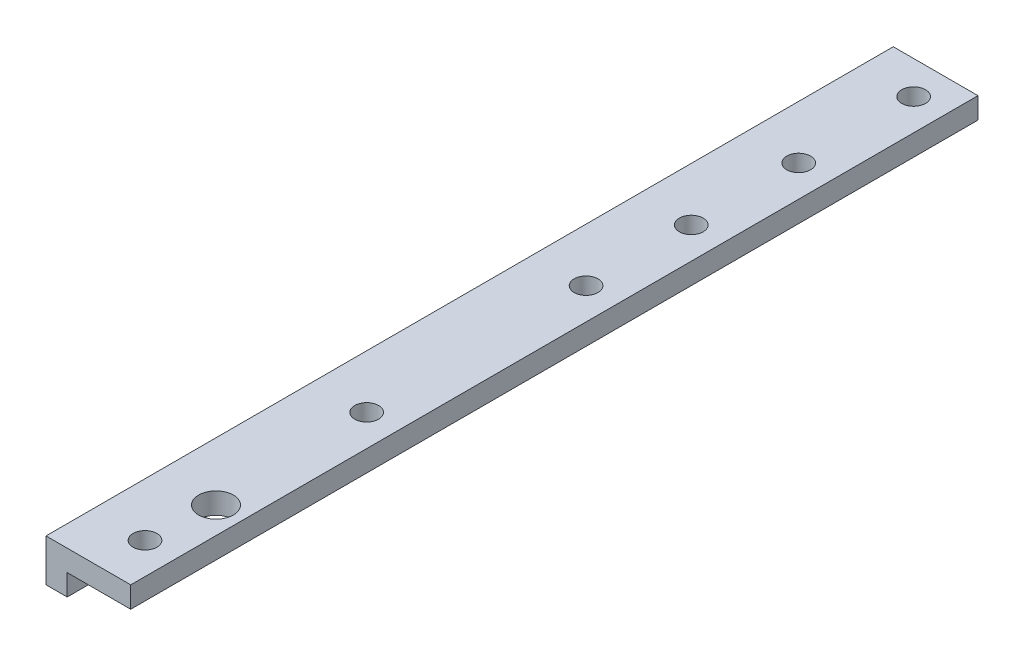
ISO-10303-21;
HEADER;
FILE_DESCRIPTION(('STEP AP214'),'2;1');
FILE_NAME('part.step','',(''),(''),'','','');
FILE_SCHEMA(('AUTOMOTIVE_DESIGN { 1 0 10303 214 1 1 1 1 }'));
ENDSEC;
DATA;
#1=APPLICATION_CONTEXT('core data for automotive mechanical design processes');
#2=APPLICATION_PROTOCOL_DEFINITION('international standard','automotive_design',2000,#1);
#3=PRODUCT_CONTEXT('',#1,'mechanical');
#4=PRODUCT('Part','Part','',(#3));
#5=PRODUCT_RELATED_PRODUCT_CATEGORY('part','',(#4));
#6=PRODUCT_DEFINITION_FORMATION('','',#4);
#7=PRODUCT_DEFINITION_CONTEXT('part definition',#1,'design');
#8=PRODUCT_DEFINITION('design','',#6,#7);
#9=PRODUCT_DEFINITION_SHAPE('','',#8);
#10=(LENGTH_UNIT() NAMED_UNIT(*) SI_UNIT(.MILLI.,.METRE.));
#11=(NAMED_UNIT(*) PLANE_ANGLE_UNIT() SI_UNIT($,.RADIAN.));
#12=(NAMED_UNIT(*) SI_UNIT($,.STERADIAN.) SOLID_ANGLE_UNIT());
#13=UNCERTAINTY_MEASURE_WITH_UNIT(LENGTH_MEASURE(1.E-05),#10,'distance_accuracy_value','');
#14=(GEOMETRIC_REPRESENTATION_CONTEXT(3) GLOBAL_UNCERTAINTY_ASSIGNED_CONTEXT((#13)) GLOBAL_UNIT_ASSIGNED_CONTEXT((#10,
#11,#12)) REPRESENTATION_CONTEXT('',''));
#15=CARTESIAN_POINT('',(0.,0.,0.));
#16=DIRECTION('',(0.,0.,1.));
#17=DIRECTION('',(1.,0.,0.));
#18=AXIS2_PLACEMENT_3D('',#15,#16,#17);
#19=CARTESIAN_POINT('',(16.,0.,160.));
#20=DIRECTION('',(0.,-1.,0.));
#21=DIRECTION('',(1.,0.,0.));
#22=AXIS2_PLACEMENT_3D('',#19,#20,#21);
#23=PLANE('',#22);
#24=CARTESIAN_POINT('',(10.9999999999979,0.,138.897931951044));
#25=DIRECTION('',(0.,-1.,0.));
#26=DIRECTION('',(1.,0.,0.));
#27=AXIS2_PLACEMENT_3D('',#24,#25,#26);
#28=CIRCLE('',#27,3.27500000000001);
#29=CARTESIAN_POINT('',(14.2749999999979,0.,138.897931951044));
#30=VERTEX_POINT('',#29);
#31=EDGE_CURVE('E202',#30,#30,#28,.T.);
#32=ORIENTED_EDGE('',*,*,#31,.T.);
#33=EDGE_LOOP('',(#32));
#34=FACE_BOUND('',#33,.T.);
#35=CARTESIAN_POINT('',(10.0723529947347,0.,6.22809053182057));
#36=DIRECTION('',(0.,-1.,0.));
#37=DIRECTION('',(0.,0.,-1.));
#38=AXIS2_PLACEMENT_3D('',#35,#36,#37);
#39=CIRCLE('',#38,2.25);
#40=CARTESIAN_POINT('',(10.0723529947347,0.,3.97809053182057));
#41=VERTEX_POINT('',#40);
#42=EDGE_CURVE('E196',#41,#41,#39,.T.);
#43=ORIENTED_EDGE('',*,*,#42,.T.);
#44=EDGE_LOOP('',(#43));
#45=FACE_BOUND('',#44,.T.);
#46=CARTESIAN_POINT('',(10.0723529947347,0.,27.9378724737865));
#47=DIRECTION('',(0.,-1.,0.));
#48=DIRECTION('',(0.,0.,-1.));
#49=AXIS2_PLACEMENT_3D('',#46,#47,#48);
#50=CIRCLE('',#49,2.25);
#51=CARTESIAN_POINT('',(10.0723529947347,0.,25.6878724737865));
#52=VERTEX_POINT('',#51);
#53=EDGE_CURVE('E190',#52,#52,#50,.T.);
#54=ORIENTED_EDGE('',*,*,#53,.T.);
#55=EDGE_LOOP('',(#54));
#56=FACE_BOUND('',#55,.T.);
#57=CARTESIAN_POINT('',(10.0723529947347,0.,48.2214643611708));
#58=DIRECTION('',(0.,-1.,0.));
#59=DIRECTION('',(0.,0.,-1.));
#60=AXIS2_PLACEMENT_3D('',#57,#58,#59);
#61=CIRCLE('',#60,2.25);
#62=CARTESIAN_POINT('',(10.0723529947347,0.,45.9714643611708));
#63=VERTEX_POINT('',#62);
#64=EDGE_CURVE('E184',#63,#63,#61,.T.);
#65=ORIENTED_EDGE('',*,*,#64,.T.);
#66=EDGE_LOOP('',(#65));
#67=FACE_BOUND('',#66,.T.);
#68=CARTESIAN_POINT('',(10.0723529947347,0.,68.0876218415207));
#69=DIRECTION('',(0.,-1.,0.));
#70=DIRECTION('',(0.,0.,-1.));
#71=AXIS2_PLACEMENT_3D('',#68,#69,#70);
#72=CIRCLE('',#71,2.25);
#73=CARTESIAN_POINT('',(10.0723529947347,0.,65.8376218415207));
#74=VERTEX_POINT('',#73);
#75=EDGE_CURVE('E178',#74,#74,#72,.T.);
#76=ORIENTED_EDGE('',*,*,#75,.T.);
#77=EDGE_LOOP('',(#76));
#78=FACE_BOUND('',#77,.T.);
#79=CARTESIAN_POINT('',(10.0723529947347,0.,109.517546490679));
#80=DIRECTION('',(0.,-1.,0.));
#81=DIRECTION('',(0.,0.,-1.));
#82=AXIS2_PLACEMENT_3D('',#79,#80,#81);
#83=CIRCLE('',#82,2.25);
#84=CARTESIAN_POINT('',(10.0723529947347,0.,107.267546490679));
#85=VERTEX_POINT('',#84);
#86=EDGE_CURVE('E172',#85,#85,#83,.T.);
#87=ORIENTED_EDGE('',*,*,#86,.T.);
#88=EDGE_LOOP('',(#87));
#89=FACE_BOUND('',#88,.T.);
#90=CARTESIAN_POINT('',(10.0723529947347,0.,151.376567413365));
#91=DIRECTION('',(0.,-1.,0.));
#92=DIRECTION('',(0.,0.,-1.));
#93=AXIS2_PLACEMENT_3D('',#90,#91,#92);
#94=CIRCLE('',#93,2.25);
#95=CARTESIAN_POINT('',(10.0723529947347,0.,149.126567413365));
#96=VERTEX_POINT('',#95);
#97=EDGE_CURVE('E125',#96,#96,#94,.T.);
#98=ORIENTED_EDGE('',*,*,#97,.T.);
#99=EDGE_LOOP('',(#98));
#100=FACE_BOUND('',#99,.T.);
#101=DIRECTION('',(-1.,0.,0.));
#102=VECTOR('',#101,1.);
#103=CARTESIAN_POINT('',(16.,0.,0.));
#104=LINE('',#103,#102);
#105=CARTESIAN_POINT('',(16.,0.,0.));
#106=VERTEX_POINT('',#105);
#107=CARTESIAN_POINT('',(0.,0.,0.));
#108=VERTEX_POINT('',#107);
#109=EDGE_CURVE('E150',#106,#108,#104,.T.);
#110=ORIENTED_EDGE('',*,*,#109,.T.);
#111=DIRECTION('',(0.,0.,-1.));
#112=VECTOR('',#111,1.);
#113=CARTESIAN_POINT('',(0.,0.,160.));
#114=LINE('',#113,#112);
#115=CARTESIAN_POINT('',(0.,0.,160.));
#116=VERTEX_POINT('',#115);
#117=EDGE_CURVE('E11',#116,#108,#114,.T.);
#118=ORIENTED_EDGE('',*,*,#117,.F.);
#119=DIRECTION('',(-1.,0.,0.));
#120=VECTOR('',#119,1.);
#121=CARTESIAN_POINT('',(16.,0.,160.));
#122=LINE('',#121,#120);
#123=CARTESIAN_POINT('',(16.,0.,160.));
#124=VERTEX_POINT('',#123);
#125=EDGE_CURVE('E141',#124,#116,#122,.T.);
#126=ORIENTED_EDGE('',*,*,#125,.F.);
#127=DIRECTION('',(0.,0.,-1.));
#128=VECTOR('',#127,1.);
#129=CARTESIAN_POINT('',(16.,0.,160.));
#130=LINE('',#129,#128);
#131=EDGE_CURVE('E138',#124,#106,#130,.T.);
#132=ORIENTED_EDGE('',*,*,#131,.T.);
#133=EDGE_LOOP('',(#110,#118,#126,#132));
#134=FACE_BOUND('',#133,.T.);
#135=ADVANCED_FACE('F34',(#34,#45,#56,#67,#78,#89,#100,#134),#23,.F.);
#136=CARTESIAN_POINT('',(0.,0.,160.));
#137=DIRECTION('',(1.,0.,0.));
#138=DIRECTION('',(0.,1.,0.));
#139=AXIS2_PLACEMENT_3D('',#136,#137,#138);
#140=PLANE('',#139);
#141=DIRECTION('',(0.,-1.,0.));
#142=VECTOR('',#141,1.);
#143=CARTESIAN_POINT('',(0.,-9.9999999999999,120.448943436496));
#144=LINE('',#143,#142);
#145=CARTESIAN_POINT('',(0.,-8.00000000000016,120.448943436496));
#146=VERTEX_POINT('',#145);
#147=CARTESIAN_POINT('',(0.,-9.99999999999991,120.448943436496));
#148=VERTEX_POINT('',#147);
#149=EDGE_CURVE('E114',#146,#148,#144,.T.);
#150=ORIENTED_EDGE('',*,*,#149,.F.);
#151=DIRECTION('',(0.,0.,-1.));
#152=VECTOR('',#151,1.);
#153=CARTESIAN_POINT('',(0.,-8.00000000000016,120.448943436496));
#154=LINE('',#153,#152);
#155=CARTESIAN_POINT('',(0.,-8.00000000000016,160.));
#156=VERTEX_POINT('',#155);
#157=EDGE_CURVE('E153',#156,#146,#154,.T.);
#158=ORIENTED_EDGE('',*,*,#157,.F.);
#159=DIRECTION('',(0.,-1.,0.));
#160=VECTOR('',#159,1.);
#161=CARTESIAN_POINT('',(0.,0.,160.));
#162=LINE('',#161,#160);
#163=EDGE_CURVE('E91',#116,#156,#162,.T.);
#164=ORIENTED_EDGE('',*,*,#163,.F.);
#165=ORIENTED_EDGE('',*,*,#117,.T.);
#166=DIRECTION('',(0.,-1.,0.));
#167=VECTOR('',#166,1.);
#168=CARTESIAN_POINT('',(0.,0.,0.));
#169=LINE('',#168,#167);
#170=CARTESIAN_POINT('',(0.,-10.,0.));
#171=VERTEX_POINT('',#170);
#172=EDGE_CURVE('E147',#108,#171,#169,.T.);
#173=ORIENTED_EDGE('',*,*,#172,.T.);
#174=DIRECTION('',(0.,0.,-1.));
#175=VECTOR('',#174,1.);
#176=CARTESIAN_POINT('',(0.,-10.,160.));
#177=LINE('',#176,#175);
#178=EDGE_CURVE('E41',#148,#171,#177,.T.);
#179=ORIENTED_EDGE('',*,*,#178,.F.);
#180=EDGE_LOOP('',(#150,#158,#164,#165,#173,#179));
#181=FACE_BOUND('',#180,.T.);
#182=ADVANCED_FACE('F241',(#181),#140,.F.);
#183=CARTESIAN_POINT('',(0.,-10.,160.));
#184=DIRECTION('',(0.,1.,0.));
#185=DIRECTION('',(0.,0.,1.));
#186=AXIS2_PLACEMENT_3D('',#183,#184,#185);
#187=PLANE('',#186);
#188=DIRECTION('',(0.,0.,-1.));
#189=VECTOR('',#188,1.);
#190=CARTESIAN_POINT('',(4.,-10.,160.));
#191=LINE('',#190,#189);
#192=CARTESIAN_POINT('',(4.,-9.99999999999991,120.448943436496));
#193=VERTEX_POINT('',#192);
#194=CARTESIAN_POINT('',(4.,-10.,0.));
#195=VERTEX_POINT('',#194);
#196=EDGE_CURVE('E123',#193,#195,#191,.T.);
#197=ORIENTED_EDGE('',*,*,#196,.F.);
#198=DIRECTION('',(1.,0.,0.));
#199=VECTOR('',#198,1.);
#200=CARTESIAN_POINT('',(-39.6015918277218,-9.9999999999999,120.448943436496));
#201=LINE('',#200,#199);
#202=EDGE_CURVE('E108',#148,#193,#201,.T.);
#203=ORIENTED_EDGE('',*,*,#202,.F.);
#204=ORIENTED_EDGE('',*,*,#178,.T.);
#205=DIRECTION('',(1.,0.,0.));
#206=VECTOR('',#205,1.);
#207=CARTESIAN_POINT('',(0.,-10.,0.));
#208=LINE('',#207,#206);
#209=EDGE_CURVE('E129',#171,#195,#208,.T.);
#210=ORIENTED_EDGE('',*,*,#209,.T.);
#211=EDGE_LOOP('',(#197,#203,#204,#210));
#212=FACE_BOUND('',#211,.T.);
#213=ADVANCED_FACE('F127',(#212),#187,.F.);
#214=CARTESIAN_POINT('',(4.,-10.,160.));
#215=DIRECTION('',(-1.,0.,0.));
#216=DIRECTION('',(0.,-1.,0.));
#217=AXIS2_PLACEMENT_3D('',#214,#215,#216);
#218=PLANE('',#217);
#219=DIRECTION('',(0.,1.,0.));
#220=VECTOR('',#219,1.);
#221=CARTESIAN_POINT('',(4.,-10.,160.));
#222=LINE('',#221,#220);
#223=CARTESIAN_POINT('',(4.,-8.00000000000017,160.));
#224=VERTEX_POINT('',#223);
#225=CARTESIAN_POINT('',(4.,-4.,160.));
#226=VERTEX_POINT('',#225);
#227=EDGE_CURVE('E157',#224,#226,#222,.T.);
#228=ORIENTED_EDGE('',*,*,#227,.F.);
#229=DIRECTION('',(0.,0.,1.));
#230=VECTOR('',#229,1.);
#231=CARTESIAN_POINT('',(4.,-8.00000000000017,120.448943436496));
#232=LINE('',#231,#230);
#233=CARTESIAN_POINT('',(4.,-8.00000000000017,120.448943436496));
#234=VERTEX_POINT('',#233);
#235=EDGE_CURVE('E48',#234,#224,#232,.T.);
#236=ORIENTED_EDGE('',*,*,#235,.F.);
#237=DIRECTION('',(0.,1.,0.));
#238=VECTOR('',#237,1.);
#239=CARTESIAN_POINT('',(4.,-9.99999999999991,120.448943436496));
#240=LINE('',#239,#238);
#241=EDGE_CURVE('E112',#193,#234,#240,.T.);
#242=ORIENTED_EDGE('',*,*,#241,.F.);
#243=ORIENTED_EDGE('',*,*,#196,.T.);
#244=DIRECTION('',(0.,1.,0.));
#245=VECTOR('',#244,1.);
#246=CARTESIAN_POINT('',(4.,-10.,0.));
#247=LINE('',#246,#245);
#248=CARTESIAN_POINT('',(4.,-4.,0.));
#249=VERTEX_POINT('',#248);
#250=EDGE_CURVE('E144',#195,#249,#247,.T.);
#251=ORIENTED_EDGE('',*,*,#250,.T.);
#252=DIRECTION('',(0.,0.,-1.));
#253=VECTOR('',#252,1.);
#254=CARTESIAN_POINT('',(4.,-4.,160.));
#255=LINE('',#254,#253);
#256=EDGE_CURVE('E131',#226,#249,#255,.T.);
#257=ORIENTED_EDGE('',*,*,#256,.F.);
#258=EDGE_LOOP('',(#228,#236,#242,#243,#251,#257));
#259=FACE_BOUND('',#258,.T.);
#260=ADVANCED_FACE('F122',(#259),#218,.F.);
#261=CARTESIAN_POINT('',(4.,-4.,160.));
#262=DIRECTION('',(0.,1.,0.));
#263=DIRECTION('',(0.,0.,1.));
#264=AXIS2_PLACEMENT_3D('',#261,#262,#263);
#265=PLANE('',#264);
#266=CARTESIAN_POINT('',(10.9999999999979,-4.,138.897931951044));
#267=DIRECTION('',(0.,-1.,0.));
#268=DIRECTION('',(0.,0.,-1.));
#269=AXIS2_PLACEMENT_3D('',#266,#267,#268);
#270=CIRCLE('',#269,3.27500000000001);
#271=CARTESIAN_POINT('',(10.9999999999979,-4.,135.622931951044));
#272=VERTEX_POINT('',#271);
#273=EDGE_CURVE('E205',#272,#272,#270,.T.);
#274=ORIENTED_EDGE('',*,*,#273,.F.);
#275=EDGE_LOOP('',(#274));
#276=FACE_BOUND('',#275,.T.);
#277=CARTESIAN_POINT('',(10.0723529947347,-4.,6.22809053182057));
#278=DIRECTION('',(0.,-1.,0.));
#279=DIRECTION('',(0.,0.,-1.));
#280=AXIS2_PLACEMENT_3D('',#277,#278,#279);
#281=CIRCLE('',#280,2.25);
#282=CARTESIAN_POINT('',(10.0723529947347,-4.,3.97809053182057));
#283=VERTEX_POINT('',#282);
#284=EDGE_CURVE('E199',#283,#283,#281,.T.);
#285=ORIENTED_EDGE('',*,*,#284,.F.);
#286=EDGE_LOOP('',(#285));
#287=FACE_BOUND('',#286,.T.);
#288=CARTESIAN_POINT('',(10.0723529947347,-4.,27.9378724737865));
#289=DIRECTION('',(0.,-1.,0.));
#290=DIRECTION('',(0.,0.,-1.));
#291=AXIS2_PLACEMENT_3D('',#288,#289,#290);
#292=CIRCLE('',#291,2.25);
#293=CARTESIAN_POINT('',(10.0723529947347,-4.,25.6878724737865));
#294=VERTEX_POINT('',#293);
#295=EDGE_CURVE('E193',#294,#294,#292,.T.);
#296=ORIENTED_EDGE('',*,*,#295,.F.);
#297=EDGE_LOOP('',(#296));
#298=FACE_BOUND('',#297,.T.);
#299=CARTESIAN_POINT('',(10.0723529947347,-4.,48.2214643611708));
#300=DIRECTION('',(0.,-1.,0.));
#301=DIRECTION('',(0.,0.,-1.));
#302=AXIS2_PLACEMENT_3D('',#299,#300,#301);
#303=CIRCLE('',#302,2.25);
#304=CARTESIAN_POINT('',(10.0723529947347,-4.,45.9714643611708));
#305=VERTEX_POINT('',#304);
#306=EDGE_CURVE('E187',#305,#305,#303,.T.);
#307=ORIENTED_EDGE('',*,*,#306,.F.);
#308=EDGE_LOOP('',(#307));
#309=FACE_BOUND('',#308,.T.);
#310=CARTESIAN_POINT('',(10.0723529947347,-4.,68.0876218415207));
#311=DIRECTION('',(0.,-1.,0.));
#312=DIRECTION('',(0.,0.,-1.));
#313=AXIS2_PLACEMENT_3D('',#310,#311,#312);
#314=CIRCLE('',#313,2.25);
#315=CARTESIAN_POINT('',(10.0723529947347,-4.,65.8376218415207));
#316=VERTEX_POINT('',#315);
#317=EDGE_CURVE('E181',#316,#316,#314,.T.);
#318=ORIENTED_EDGE('',*,*,#317,.F.);
#319=EDGE_LOOP('',(#318));
#320=FACE_BOUND('',#319,.T.);
#321=CARTESIAN_POINT('',(10.0723529947347,-4.,109.517546490679));
#322=DIRECTION('',(0.,-1.,0.));
#323=DIRECTION('',(0.,0.,-1.));
#324=AXIS2_PLACEMENT_3D('',#321,#322,#323);
#325=CIRCLE('',#324,2.25);
#326=CARTESIAN_POINT('',(10.0723529947347,-4.,107.267546490679));
#327=VERTEX_POINT('',#326);
#328=EDGE_CURVE('E175',#327,#327,#325,.T.);
#329=ORIENTED_EDGE('',*,*,#328,.F.);
#330=EDGE_LOOP('',(#329));
#331=FACE_BOUND('',#330,.T.);
#332=CARTESIAN_POINT('',(10.0723529947347,-4.,151.376567413365));
#333=DIRECTION('',(0.,-1.,0.));
#334=DIRECTION('',(0.,0.,-1.));
#335=AXIS2_PLACEMENT_3D('',#332,#333,#334);
#336=CIRCLE('',#335,2.25);
#337=CARTESIAN_POINT('',(10.0723529947347,-4.,149.126567413365));
#338=VERTEX_POINT('',#337);
#339=EDGE_CURVE('E169',#338,#338,#336,.T.);
#340=ORIENTED_EDGE('',*,*,#339,.F.);
#341=EDGE_LOOP('',(#340));
#342=FACE_BOUND('',#341,.T.);
#343=DIRECTION('',(1.,0.,0.));
#344=VECTOR('',#343,1.);
#345=CARTESIAN_POINT('',(4.,-4.,0.));
#346=LINE('',#345,#344);
#347=CARTESIAN_POINT('',(16.,-4.,0.));
#348=VERTEX_POINT('',#347);
#349=EDGE_CURVE('E142',#249,#348,#346,.T.);
#350=ORIENTED_EDGE('',*,*,#349,.T.);
#351=DIRECTION('',(0.,0.,-1.));
#352=VECTOR('',#351,1.);
#353=CARTESIAN_POINT('',(16.,-4.,160.));
#354=LINE('',#353,#352);
#355=CARTESIAN_POINT('',(16.,-4.,160.));
#356=VERTEX_POINT('',#355);
#357=EDGE_CURVE('E134',#356,#348,#354,.T.);
#358=ORIENTED_EDGE('',*,*,#357,.F.);
#359=DIRECTION('',(1.,0.,0.));
#360=VECTOR('',#359,1.);
#361=CARTESIAN_POINT('',(4.,-4.,160.));
#362=LINE('',#361,#360);
#363=EDGE_CURVE('E155',#226,#356,#362,.T.);
#364=ORIENTED_EDGE('',*,*,#363,.F.);
#365=ORIENTED_EDGE('',*,*,#256,.T.);
#366=EDGE_LOOP('',(#350,#358,#364,#365));
#367=FACE_BOUND('',#366,.T.);
#368=ADVANCED_FACE('F212',(#276,#287,#298,#309,#320,#331,#342,#367),#265,.F.);
#369=CARTESIAN_POINT('',(16.,-4.,160.));
#370=DIRECTION('',(-1.,0.,0.));
#371=DIRECTION('',(0.,0.,1.));
#372=AXIS2_PLACEMENT_3D('',#369,#370,#371);
#373=PLANE('',#372);
#374=DIRECTION('',(0.,1.,0.));
#375=VECTOR('',#374,1.);
#376=CARTESIAN_POINT('',(16.,-4.,0.));
#377=LINE('',#376,#375);
#378=EDGE_CURVE('E84',#348,#106,#377,.T.);
#379=ORIENTED_EDGE('',*,*,#378,.T.);
#380=ORIENTED_EDGE('',*,*,#131,.F.);
#381=DIRECTION('',(0.,1.,0.));
#382=VECTOR('',#381,1.);
#383=CARTESIAN_POINT('',(16.,-4.,160.));
#384=LINE('',#383,#382);
#385=EDGE_CURVE('E57',#356,#124,#384,.T.);
#386=ORIENTED_EDGE('',*,*,#385,.F.);
#387=ORIENTED_EDGE('',*,*,#357,.T.);
#388=EDGE_LOOP('',(#379,#380,#386,#387));
#389=FACE_BOUND('',#388,.T.);
#390=ADVANCED_FACE('F215',(#389),#373,.F.);
#391=CARTESIAN_POINT('',(0.,0.,160.));
#392=DIRECTION('',(0.,0.,1.));
#393=DIRECTION('',(1.,0.,0.));
#394=AXIS2_PLACEMENT_3D('',#391,#392,#393);
#395=PLANE('',#394);
#396=DIRECTION('',(1.,0.,0.));
#397=VECTOR('',#396,1.);
#398=CARTESIAN_POINT('',(-39.6015918277218,-8.00000000000016,160.));
#399=LINE('',#398,#397);
#400=EDGE_CURVE('E162',#156,#224,#399,.T.);
#401=ORIENTED_EDGE('',*,*,#400,.T.);
#402=ORIENTED_EDGE('',*,*,#227,.T.);
#403=ORIENTED_EDGE('',*,*,#363,.T.);
#404=ORIENTED_EDGE('',*,*,#385,.T.);
#405=ORIENTED_EDGE('',*,*,#125,.T.);
#406=ORIENTED_EDGE('',*,*,#163,.T.);
#407=EDGE_LOOP('',(#401,#402,#403,#404,#405,#406));
#408=FACE_BOUND('',#407,.T.);
#409=ADVANCED_FACE('F239',(#408),#395,.T.);
#410=CARTESIAN_POINT('',(0.,0.,0.));
#411=DIRECTION('',(0.,0.,1.));
#412=DIRECTION('',(1.,0.,0.));
#413=AXIS2_PLACEMENT_3D('',#410,#411,#412);
#414=PLANE('',#413);
#415=ORIENTED_EDGE('',*,*,#109,.F.);
#416=ORIENTED_EDGE('',*,*,#378,.F.);
#417=ORIENTED_EDGE('',*,*,#349,.F.);
#418=ORIENTED_EDGE('',*,*,#250,.F.);
#419=ORIENTED_EDGE('',*,*,#209,.F.);
#420=ORIENTED_EDGE('',*,*,#172,.F.);
#421=EDGE_LOOP('',(#415,#416,#417,#418,#419,#420));
#422=FACE_BOUND('',#421,.T.);
#423=ADVANCED_FACE('F235',(#422),#414,.F.);
#424=CARTESIAN_POINT('',(-39.6015918277218,-8.00000000000016,120.448943436496));
#425=DIRECTION('',(0.,1.,0.));
#426=DIRECTION('',(-1.,0.,0.));
#427=AXIS2_PLACEMENT_3D('',#424,#425,#426);
#428=PLANE('',#427);
#429=ORIENTED_EDGE('',*,*,#157,.T.);
#430=DIRECTION('',(1.,0.,0.));
#431=VECTOR('',#430,1.);
#432=CARTESIAN_POINT('',(-39.6015918277218,-8.00000000000016,120.448943436496));
#433=LINE('',#432,#431);
#434=EDGE_CURVE('E118',#146,#234,#433,.T.);
#435=ORIENTED_EDGE('',*,*,#434,.T.);
#436=ORIENTED_EDGE('',*,*,#235,.T.);
#437=ORIENTED_EDGE('',*,*,#400,.F.);
#438=EDGE_LOOP('',(#429,#435,#436,#437));
#439=FACE_BOUND('',#438,.T.);
#440=ADVANCED_FACE('F240',(#439),#428,.F.);
#441=CARTESIAN_POINT('',(-39.6015918277218,-9.9999999999999,120.448943436496));
#442=DIRECTION('',(0.,0.,-1.));
#443=DIRECTION('',(-1.,0.,0.));
#444=AXIS2_PLACEMENT_3D('',#441,#442,#443);
#445=PLANE('',#444);
#446=ORIENTED_EDGE('',*,*,#149,.T.);
#447=ORIENTED_EDGE('',*,*,#202,.T.);
#448=ORIENTED_EDGE('',*,*,#241,.T.);
#449=ORIENTED_EDGE('',*,*,#434,.F.);
#450=EDGE_LOOP('',(#446,#447,#448,#449));
#451=FACE_BOUND('',#450,.T.);
#452=ADVANCED_FACE('F110',(#451),#445,.F.);
#453=CARTESIAN_POINT('',(10.0723529947347,-4.,151.376567413365));
#454=DIRECTION('',(0.,-1.,0.));
#455=DIRECTION('',(0.,0.,-1.));
#456=AXIS2_PLACEMENT_3D('',#453,#454,#455);
#457=CYLINDRICAL_SURFACE('',#456,2.25);
#458=ORIENTED_EDGE('',*,*,#97,.F.);
#459=EDGE_LOOP('',(#458));
#460=FACE_BOUND('',#459,.T.);
#461=ORIENTED_EDGE('',*,*,#339,.T.);
#462=EDGE_LOOP('',(#461));
#463=FACE_BOUND('',#462,.T.);
#464=ADVANCED_FACE('F260',(#460,#463),#457,.F.);
#465=CARTESIAN_POINT('',(10.0723529947347,-4.,109.517546490679));
#466=DIRECTION('',(0.,-1.,0.));
#467=DIRECTION('',(0.,0.,-1.));
#468=AXIS2_PLACEMENT_3D('',#465,#466,#467);
#469=CYLINDRICAL_SURFACE('',#468,2.25);
#470=ORIENTED_EDGE('',*,*,#86,.F.);
#471=EDGE_LOOP('',(#470));
#472=FACE_BOUND('',#471,.T.);
#473=ORIENTED_EDGE('',*,*,#328,.T.);
#474=EDGE_LOOP('',(#473));
#475=FACE_BOUND('',#474,.T.);
#476=ADVANCED_FACE('F265',(#472,#475),#469,.F.);
#477=CARTESIAN_POINT('',(10.0723529947347,-4.,68.0876218415207));
#478=DIRECTION('',(0.,-1.,0.));
#479=DIRECTION('',(0.,0.,-1.));
#480=AXIS2_PLACEMENT_3D('',#477,#478,#479);
#481=CYLINDRICAL_SURFACE('',#480,2.25);
#482=ORIENTED_EDGE('',*,*,#75,.F.);
#483=EDGE_LOOP('',(#482));
#484=FACE_BOUND('',#483,.T.);
#485=ORIENTED_EDGE('',*,*,#317,.T.);
#486=EDGE_LOOP('',(#485));
#487=FACE_BOUND('',#486,.T.);
#488=ADVANCED_FACE('F269',(#484,#487),#481,.F.);
#489=CARTESIAN_POINT('',(10.0723529947347,-4.,48.2214643611708));
#490=DIRECTION('',(0.,-1.,0.));
#491=DIRECTION('',(0.,0.,-1.));
#492=AXIS2_PLACEMENT_3D('',#489,#490,#491);
#493=CYLINDRICAL_SURFACE('',#492,2.25);
#494=ORIENTED_EDGE('',*,*,#64,.F.);
#495=EDGE_LOOP('',(#494));
#496=FACE_BOUND('',#495,.T.);
#497=ORIENTED_EDGE('',*,*,#306,.T.);
#498=EDGE_LOOP('',(#497));
#499=FACE_BOUND('',#498,.T.);
#500=ADVANCED_FACE('F273',(#496,#499),#493,.F.);
#501=CARTESIAN_POINT('',(10.0723529947347,-4.,27.9378724737865));
#502=DIRECTION('',(0.,-1.,0.));
#503=DIRECTION('',(0.,0.,-1.));
#504=AXIS2_PLACEMENT_3D('',#501,#502,#503);
#505=CYLINDRICAL_SURFACE('',#504,2.25);
#506=ORIENTED_EDGE('',*,*,#53,.F.);
#507=EDGE_LOOP('',(#506));
#508=FACE_BOUND('',#507,.T.);
#509=ORIENTED_EDGE('',*,*,#295,.T.);
#510=EDGE_LOOP('',(#509));
#511=FACE_BOUND('',#510,.T.);
#512=ADVANCED_FACE('F277',(#508,#511),#505,.F.);
#513=CARTESIAN_POINT('',(10.0723529947347,-4.,6.22809053182057));
#514=DIRECTION('',(0.,-1.,0.));
#515=DIRECTION('',(0.,0.,-1.));
#516=AXIS2_PLACEMENT_3D('',#513,#514,#515);
#517=CYLINDRICAL_SURFACE('',#516,2.25);
#518=ORIENTED_EDGE('',*,*,#42,.F.);
#519=EDGE_LOOP('',(#518));
#520=FACE_BOUND('',#519,.T.);
#521=ORIENTED_EDGE('',*,*,#284,.T.);
#522=EDGE_LOOP('',(#521));
#523=FACE_BOUND('',#522,.T.);
#524=ADVANCED_FACE('F281',(#520,#523),#517,.F.);
#525=CARTESIAN_POINT('',(10.9999999999979,6.,138.897931951044));
#526=DIRECTION('',(0.,-1.,0.));
#527=DIRECTION('',(0.,0.,-1.));
#528=AXIS2_PLACEMENT_3D('',#525,#526,#527);
#529=CYLINDRICAL_SURFACE('',#528,3.27500000000001);
#530=ORIENTED_EDGE('',*,*,#273,.T.);
#531=EDGE_LOOP('',(#530));
#532=FACE_BOUND('',#531,.T.);
#533=ORIENTED_EDGE('',*,*,#31,.F.);
#534=EDGE_LOOP('',(#533));
#535=FACE_BOUND('',#534,.T.);
#536=ADVANCED_FACE('F209',(#532,#535),#529,.F.);
#537=CLOSED_SHELL('',(#135,#182,#213,#260,#368,#390,#409,#423,#440,#452,#464,#476,#488,#500,
#512,#524,#536));
#538=MANIFOLD_SOLID_BREP('B2',#537);
#539=ADVANCED_BREP_SHAPE_REPRESENTATION('',(#18,#538),#14);
#540=SHAPE_DEFINITION_REPRESENTATION(#9,#539);
ENDSEC;
END-ISO-10303-21;
